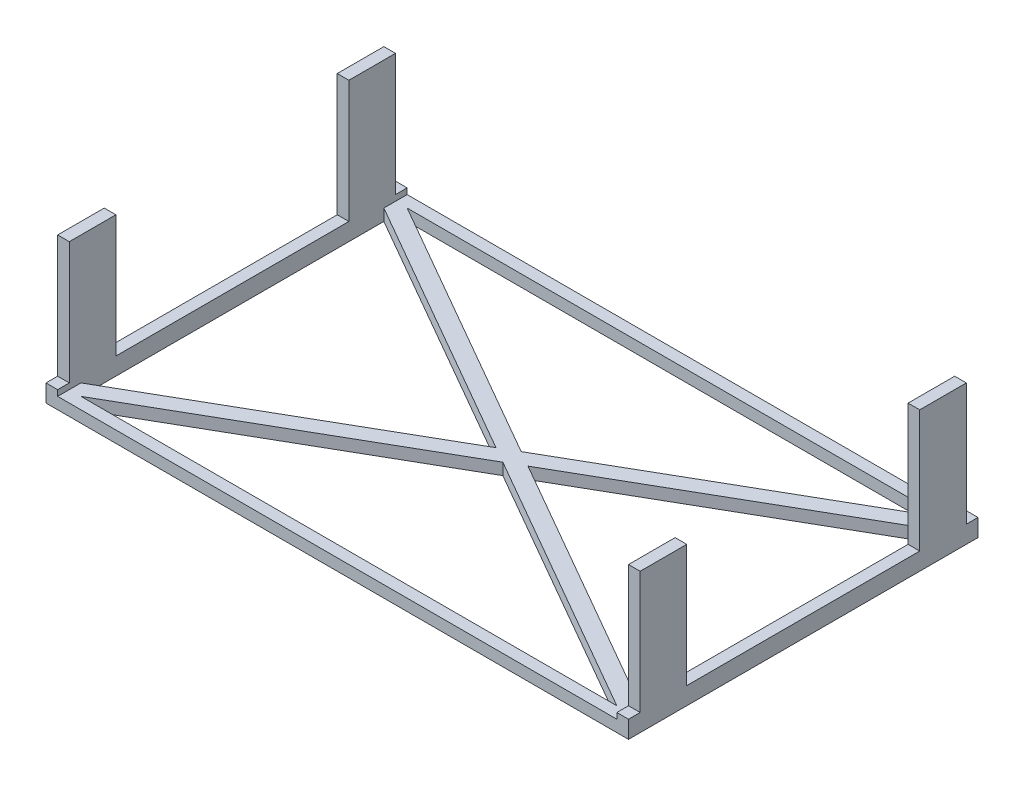
ISO-10303-21;
HEADER;
FILE_DESCRIPTION(('STEP AP214'),'2;1');
FILE_NAME('part.step','',(''),(''),'','','');
FILE_SCHEMA(('AUTOMOTIVE_DESIGN { 1 0 10303 214 1 1 1 1 }'));
ENDSEC;
DATA;
#1=APPLICATION_CONTEXT('core data for automotive mechanical design processes');
#2=APPLICATION_PROTOCOL_DEFINITION('international standard','automotive_design',2000,#1);
#3=PRODUCT_CONTEXT('',#1,'mechanical');
#4=PRODUCT('Part','Part','',(#3));
#5=PRODUCT_RELATED_PRODUCT_CATEGORY('part','',(#4));
#6=PRODUCT_DEFINITION_FORMATION('','',#4);
#7=PRODUCT_DEFINITION_CONTEXT('part definition',#1,'design');
#8=PRODUCT_DEFINITION('design','',#6,#7);
#9=PRODUCT_DEFINITION_SHAPE('','',#8);
#10=(LENGTH_UNIT() NAMED_UNIT(*) SI_UNIT(.MILLI.,.METRE.));
#11=(NAMED_UNIT(*) PLANE_ANGLE_UNIT() SI_UNIT($,.RADIAN.));
#12=(NAMED_UNIT(*) SI_UNIT($,.STERADIAN.) SOLID_ANGLE_UNIT());
#13=UNCERTAINTY_MEASURE_WITH_UNIT(LENGTH_MEASURE(1.E-05),#10,'distance_accuracy_value','');
#14=(GEOMETRIC_REPRESENTATION_CONTEXT(3) GLOBAL_UNCERTAINTY_ASSIGNED_CONTEXT((#13)) GLOBAL_UNIT_ASSIGNED_CONTEXT((#10,
#11,#12)) REPRESENTATION_CONTEXT('',''));
#15=CARTESIAN_POINT('',(0.,0.,0.));
#16=DIRECTION('',(0.,0.,1.));
#17=DIRECTION('',(1.,0.,0.));
#18=AXIS2_PLACEMENT_3D('',#15,#16,#17);
#19=CARTESIAN_POINT('',(0.,120.,0.));
#20=DIRECTION('',(0.,1.,0.));
#21=DIRECTION('',(0.,0.,1.));
#22=AXIS2_PLACEMENT_3D('',#19,#20,#21);
#23=PLANE('',#22);
#24=DIRECTION('',(-1.,0.,0.));
#25=VECTOR('',#24,1.);
#26=CARTESIAN_POINT('',(500.,120.,9.99999999999986));
#27=LINE('',#26,#25);
#28=CARTESIAN_POINT('',(500.,120.,9.99999999999986));
#29=VERTEX_POINT('',#28);
#30=CARTESIAN_POINT('',(490.,120.,9.99999999999986));
#31=VERTEX_POINT('',#30);
#32=EDGE_CURVE('E483',#29,#31,#27,.T.);
#33=ORIENTED_EDGE('',*,*,#32,.T.);
#34=DIRECTION('',(0.,0.,-1.));
#35=VECTOR('',#34,1.);
#36=CARTESIAN_POINT('',(490.,120.,300.));
#37=LINE('',#36,#35);
#38=CARTESIAN_POINT('',(490.,120.,49.9999999999999));
#39=VERTEX_POINT('',#38);
#40=EDGE_CURVE('E422',#39,#31,#37,.T.);
#41=ORIENTED_EDGE('',*,*,#40,.F.);
#42=DIRECTION('',(-1.,0.,0.));
#43=VECTOR('',#42,1.);
#44=CARTESIAN_POINT('',(500.,120.,49.9999999999999));
#45=LINE('',#44,#43);
#46=CARTESIAN_POINT('',(500.,120.,49.9999999999999));
#47=VERTEX_POINT('',#46);
#48=EDGE_CURVE('E535',#47,#39,#45,.T.);
#49=ORIENTED_EDGE('',*,*,#48,.F.);
#50=DIRECTION('',(0.,0.,1.));
#51=VECTOR('',#50,1.);
#52=CARTESIAN_POINT('',(500.,120.,0.));
#53=LINE('',#52,#51);
#54=EDGE_CURVE('E314',#29,#47,#53,.T.);
#55=ORIENTED_EDGE('',*,*,#54,.F.);
#56=EDGE_LOOP('',(#33,#41,#49,#55));
#57=FACE_BOUND('',#56,.T.);
#58=ADVANCED_FACE('F41',(#57),#23,.T.);
#59=CARTESIAN_POINT('',(10.,120.,10.));
#60=VERTEX_POINT('',#59);
#61=CARTESIAN_POINT('',(0.,120.,10.));
#62=VERTEX_POINT('',#61);
#63=EDGE_CURVE('E488',#60,#62,#27,.T.);
#64=ORIENTED_EDGE('',*,*,#63,.T.);
#65=DIRECTION('',(0.,0.,1.));
#66=VECTOR('',#65,1.);
#67=CARTESIAN_POINT('',(0.,120.,0.));
#68=LINE('',#67,#66);
#69=CARTESIAN_POINT('',(0.,120.,50.));
#70=VERTEX_POINT('',#69);
#71=EDGE_CURVE('E442',#62,#70,#68,.T.);
#72=ORIENTED_EDGE('',*,*,#71,.T.);
#73=CARTESIAN_POINT('',(10.,120.,50.));
#74=VERTEX_POINT('',#73);
#75=EDGE_CURVE('E539',#74,#70,#45,.T.);
#76=ORIENTED_EDGE('',*,*,#75,.F.);
#77=DIRECTION('',(0.,0.,-1.));
#78=VECTOR('',#77,1.);
#79=CARTESIAN_POINT('',(10.,120.,300.));
#80=LINE('',#79,#78);
#81=EDGE_CURVE('E428',#74,#60,#80,.T.);
#82=ORIENTED_EDGE('',*,*,#81,.T.);
#83=EDGE_LOOP('',(#64,#72,#76,#82));
#84=FACE_BOUND('',#83,.T.);
#85=ADVANCED_FACE('F710',(#84),#23,.T.);
#86=DIRECTION('',(-1.,0.,0.));
#87=VECTOR('',#86,1.);
#88=CARTESIAN_POINT('',(500.,120.,290.));
#89=LINE('',#88,#87);
#90=CARTESIAN_POINT('',(500.,120.,290.));
#91=VERTEX_POINT('',#90);
#92=CARTESIAN_POINT('',(490.,120.,290.));
#93=VERTEX_POINT('',#92);
#94=EDGE_CURVE('E474',#91,#93,#89,.T.);
#95=ORIENTED_EDGE('',*,*,#94,.F.);
#96=CARTESIAN_POINT('',(500.,120.,250.));
#97=VERTEX_POINT('',#96);
#98=EDGE_CURVE('E444',#97,#91,#53,.T.);
#99=ORIENTED_EDGE('',*,*,#98,.F.);
#100=DIRECTION('',(-1.,0.,0.));
#101=VECTOR('',#100,1.);
#102=CARTESIAN_POINT('',(500.,120.,250.));
#103=LINE('',#102,#101);
#104=CARTESIAN_POINT('',(490.,120.,250.));
#105=VERTEX_POINT('',#104);
#106=EDGE_CURVE('E540',#97,#105,#103,.T.);
#107=ORIENTED_EDGE('',*,*,#106,.T.);
#108=EDGE_CURVE('E426',#93,#105,#37,.T.);
#109=ORIENTED_EDGE('',*,*,#108,.F.);
#110=EDGE_LOOP('',(#95,#99,#107,#109));
#111=FACE_BOUND('',#110,.T.);
#112=ADVANCED_FACE('F687',(#111),#23,.T.);
#113=CARTESIAN_POINT('',(0.,120.,0.));
#114=DIRECTION('',(1.,0.,0.));
#115=DIRECTION('',(0.,0.,-1.));
#116=AXIS2_PLACEMENT_3D('',#113,#114,#115);
#117=PLANE('',#116);
#118=DIRECTION('',(0.,0.,1.));
#119=VECTOR('',#118,1.);
#120=CARTESIAN_POINT('',(0.,15.,290.));
#121=LINE('',#120,#119);
#122=CARTESIAN_POINT('',(0.,15.,290.));
#123=VERTEX_POINT('',#122);
#124=CARTESIAN_POINT('',(0.,15.,300.));
#125=VERTEX_POINT('',#124);
#126=EDGE_CURVE('E495',#123,#125,#121,.T.);
#127=ORIENTED_EDGE('',*,*,#126,.F.);
#128=DIRECTION('',(0.,-1.,0.));
#129=VECTOR('',#128,1.);
#130=CARTESIAN_POINT('',(0.,120.,290.));
#131=LINE('',#130,#129);
#132=CARTESIAN_POINT('',(0.,120.,290.));
#133=VERTEX_POINT('',#132);
#134=EDGE_CURVE('E500',#133,#123,#131,.T.);
#135=ORIENTED_EDGE('',*,*,#134,.F.);
#136=CARTESIAN_POINT('',(0.,120.,250.));
#137=VERTEX_POINT('',#136);
#138=EDGE_CURVE('E438',#137,#133,#68,.T.);
#139=ORIENTED_EDGE('',*,*,#138,.F.);
#140=DIRECTION('',(0.,1.,0.));
#141=VECTOR('',#140,1.);
#142=CARTESIAN_POINT('',(0.,120.,250.));
#143=LINE('',#142,#141);
#144=CARTESIAN_POINT('',(0.,15.,250.));
#145=VERTEX_POINT('',#144);
#146=EDGE_CURVE('E517',#145,#137,#143,.T.);
#147=ORIENTED_EDGE('',*,*,#146,.F.);
#148=DIRECTION('',(0.,0.,1.));
#149=VECTOR('',#148,1.);
#150=CARTESIAN_POINT('',(0.,15.,50.));
#151=LINE('',#150,#149);
#152=CARTESIAN_POINT('',(0.,15.,50.));
#153=VERTEX_POINT('',#152);
#154=EDGE_CURVE('E529',#153,#145,#151,.T.);
#155=ORIENTED_EDGE('',*,*,#154,.F.);
#156=DIRECTION('',(0.,-1.,0.));
#157=VECTOR('',#156,1.);
#158=CARTESIAN_POINT('',(0.,120.,50.));
#159=LINE('',#158,#157);
#160=EDGE_CURVE('E487',#70,#153,#159,.T.);
#161=ORIENTED_EDGE('',*,*,#160,.F.);
#162=ORIENTED_EDGE('',*,*,#71,.F.);
#163=DIRECTION('',(0.,1.,0.));
#164=VECTOR('',#163,1.);
#165=CARTESIAN_POINT('',(0.,120.,10.));
#166=LINE('',#165,#164);
#167=CARTESIAN_POINT('',(0.,15.,10.));
#168=VERTEX_POINT('',#167);
#169=EDGE_CURVE('E287',#168,#62,#166,.T.);
#170=ORIENTED_EDGE('',*,*,#169,.F.);
#171=DIRECTION('',(0.,0.,1.));
#172=VECTOR('',#171,1.);
#173=CARTESIAN_POINT('',(0.,15.,0.));
#174=LINE('',#173,#172);
#175=CARTESIAN_POINT('',(0.,15.,0.));
#176=VERTEX_POINT('',#175);
#177=EDGE_CURVE('E470',#176,#168,#174,.T.);
#178=ORIENTED_EDGE('',*,*,#177,.F.);
#179=DIRECTION('',(0.,-1.,0.));
#180=VECTOR('',#179,1.);
#181=CARTESIAN_POINT('',(0.,120.,0.));
#182=LINE('',#181,#180);
#183=CARTESIAN_POINT('',(0.,0.,0.));
#184=VERTEX_POINT('',#183);
#185=EDGE_CURVE('E308',#176,#184,#182,.T.);
#186=ORIENTED_EDGE('',*,*,#185,.T.);
#187=DIRECTION('',(0.,0.,1.));
#188=VECTOR('',#187,1.);
#189=CARTESIAN_POINT('',(0.,0.,0.));
#190=LINE('',#189,#188);
#191=CARTESIAN_POINT('',(0.,0.,300.));
#192=VERTEX_POINT('',#191);
#193=EDGE_CURVE('E448',#184,#192,#190,.T.);
#194=ORIENTED_EDGE('',*,*,#193,.T.);
#195=DIRECTION('',(0.,-1.,0.));
#196=VECTOR('',#195,1.);
#197=CARTESIAN_POINT('',(0.,120.,300.));
#198=LINE('',#197,#196);
#199=EDGE_CURVE('E312',#125,#192,#198,.T.);
#200=ORIENTED_EDGE('',*,*,#199,.F.);
#201=EDGE_LOOP('',(#127,#135,#139,#147,#155,#161,#162,#170,#178,#186,#194,#200));
#202=FACE_BOUND('',#201,.T.);
#203=ADVANCED_FACE('F43',(#202),#117,.F.);
#204=CARTESIAN_POINT('',(0.,120.,300.));
#205=DIRECTION('',(0.,0.,-1.));
#206=DIRECTION('',(-1.,0.,0.));
#207=AXIS2_PLACEMENT_3D('',#204,#205,#206);
#208=PLANE('',#207);
#209=DIRECTION('',(0.,-1.,0.));
#210=VECTOR('',#209,1.);
#211=CARTESIAN_POINT('',(500.,120.,300.));
#212=LINE('',#211,#210);
#213=CARTESIAN_POINT('',(500.,15.,300.));
#214=VERTEX_POINT('',#213);
#215=CARTESIAN_POINT('',(500.,0.,300.));
#216=VERTEX_POINT('',#215);
#217=EDGE_CURVE('E307',#214,#216,#212,.T.);
#218=ORIENTED_EDGE('',*,*,#217,.F.);
#219=DIRECTION('',(-1.,0.,0.));
#220=VECTOR('',#219,1.);
#221=CARTESIAN_POINT('',(500.,15.,300.));
#222=LINE('',#221,#220);
#223=CARTESIAN_POINT('',(490.,15.,300.));
#224=VERTEX_POINT('',#223);
#225=EDGE_CURVE('E506',#214,#224,#222,.T.);
#226=ORIENTED_EDGE('',*,*,#225,.T.);
#227=DIRECTION('',(0.,-1.,0.));
#228=VECTOR('',#227,1.);
#229=CARTESIAN_POINT('',(490.,120.,300.));
#230=LINE('',#229,#228);
#231=CARTESIAN_POINT('',(490.,10.,300.));
#232=VERTEX_POINT('',#231);
#233=EDGE_CURVE('E407',#224,#232,#230,.T.);
#234=ORIENTED_EDGE('',*,*,#233,.T.);
#235=DIRECTION('',(-1.,0.,0.));
#236=VECTOR('',#235,1.);
#237=CARTESIAN_POINT('',(490.,10.,300.));
#238=LINE('',#237,#236);
#239=CARTESIAN_POINT('',(10.,10.,300.));
#240=VERTEX_POINT('',#239);
#241=EDGE_CURVE('E398',#232,#240,#238,.T.);
#242=ORIENTED_EDGE('',*,*,#241,.T.);
#243=DIRECTION('',(0.,1.,0.));
#244=VECTOR('',#243,1.);
#245=CARTESIAN_POINT('',(10.,120.,300.));
#246=LINE('',#245,#244);
#247=CARTESIAN_POINT('',(10.,15.,300.));
#248=VERTEX_POINT('',#247);
#249=EDGE_CURVE('E387',#240,#248,#246,.T.);
#250=ORIENTED_EDGE('',*,*,#249,.T.);
#251=EDGE_CURVE('E395',#248,#125,#222,.T.);
#252=ORIENTED_EDGE('',*,*,#251,.T.);
#253=ORIENTED_EDGE('',*,*,#199,.T.);
#254=DIRECTION('',(1.,0.,0.));
#255=VECTOR('',#254,1.);
#256=CARTESIAN_POINT('',(0.,0.,300.));
#257=LINE('',#256,#255);
#258=EDGE_CURVE('E452',#192,#216,#257,.T.);
#259=ORIENTED_EDGE('',*,*,#258,.T.);
#260=EDGE_LOOP('',(#218,#226,#234,#242,#250,#252,#253,#259));
#261=FACE_BOUND('',#260,.T.);
#262=ADVANCED_FACE('F394',(#261),#208,.F.);
#263=CARTESIAN_POINT('',(500.,120.,0.));
#264=DIRECTION('',(1.,0.,0.));
#265=DIRECTION('',(0.,0.,-1.));
#266=AXIS2_PLACEMENT_3D('',#263,#264,#265);
#267=PLANE('',#266);
#268=DIRECTION('',(0.,-1.,0.));
#269=VECTOR('',#268,1.);
#270=CARTESIAN_POINT('',(500.,120.,290.));
#271=LINE('',#270,#269);
#272=CARTESIAN_POINT('',(500.,15.,290.));
#273=VERTEX_POINT('',#272);
#274=EDGE_CURVE('E491',#91,#273,#271,.T.);
#275=ORIENTED_EDGE('',*,*,#274,.T.);
#276=DIRECTION('',(0.,0.,1.));
#277=VECTOR('',#276,1.);
#278=CARTESIAN_POINT('',(500.,15.,290.));
#279=LINE('',#278,#277);
#280=EDGE_CURVE('E494',#273,#214,#279,.T.);
#281=ORIENTED_EDGE('',*,*,#280,.T.);
#282=ORIENTED_EDGE('',*,*,#217,.T.);
#283=DIRECTION('',(0.,0.,1.));
#284=VECTOR('',#283,1.);
#285=CARTESIAN_POINT('',(500.,0.,0.));
#286=LINE('',#285,#284);
#287=CARTESIAN_POINT('',(500.,0.,0.));
#288=VERTEX_POINT('',#287);
#289=EDGE_CURVE('E304',#288,#216,#286,.T.);
#290=ORIENTED_EDGE('',*,*,#289,.F.);
#291=DIRECTION('',(0.,-1.,0.));
#292=VECTOR('',#291,1.);
#293=CARTESIAN_POINT('',(500.,120.,0.));
#294=LINE('',#293,#292);
#295=CARTESIAN_POINT('',(500.,15.,-1.25919086687097E-13));
#296=VERTEX_POINT('',#295);
#297=EDGE_CURVE('E293',#296,#288,#294,.T.);
#298=ORIENTED_EDGE('',*,*,#297,.F.);
#299=DIRECTION('',(0.,0.,1.));
#300=VECTOR('',#299,1.);
#301=CARTESIAN_POINT('',(500.,15.,-1.25919086687097E-13));
#302=LINE('',#301,#300);
#303=CARTESIAN_POINT('',(500.,15.,9.99999999999987));
#304=VERTEX_POINT('',#303);
#305=EDGE_CURVE('E274',#296,#304,#302,.T.);
#306=ORIENTED_EDGE('',*,*,#305,.T.);
#307=DIRECTION('',(0.,1.,0.));
#308=VECTOR('',#307,1.);
#309=CARTESIAN_POINT('',(500.,120.,9.99999999999986));
#310=LINE('',#309,#308);
#311=EDGE_CURVE('E286',#304,#29,#310,.T.);
#312=ORIENTED_EDGE('',*,*,#311,.T.);
#313=ORIENTED_EDGE('',*,*,#54,.T.);
#314=DIRECTION('',(0.,-1.,0.));
#315=VECTOR('',#314,1.);
#316=CARTESIAN_POINT('',(500.,120.,49.9999999999999));
#317=LINE('',#316,#315);
#318=CARTESIAN_POINT('',(500.,15.,49.9999999999999));
#319=VERTEX_POINT('',#318);
#320=EDGE_CURVE('E512',#47,#319,#317,.T.);
#321=ORIENTED_EDGE('',*,*,#320,.T.);
#322=DIRECTION('',(0.,0.,1.));
#323=VECTOR('',#322,1.);
#324=CARTESIAN_POINT('',(500.,15.,49.9999999999999));
#325=LINE('',#324,#323);
#326=CARTESIAN_POINT('',(500.,15.,250.));
#327=VERTEX_POINT('',#326);
#328=EDGE_CURVE('E516',#319,#327,#325,.T.);
#329=ORIENTED_EDGE('',*,*,#328,.T.);
#330=DIRECTION('',(0.,1.,0.));
#331=VECTOR('',#330,1.);
#332=CARTESIAN_POINT('',(500.,120.,250.));
#333=LINE('',#332,#331);
#334=EDGE_CURVE('E521',#327,#97,#333,.T.);
#335=ORIENTED_EDGE('',*,*,#334,.T.);
#336=ORIENTED_EDGE('',*,*,#98,.T.);
#337=EDGE_LOOP('',(#275,#281,#282,#290,#298,#306,#312,#313,#321,#329,#335,#336));
#338=FACE_BOUND('',#337,.T.);
#339=ADVANCED_FACE('F302',(#338),#267,.T.);
#340=CARTESIAN_POINT('',(0.,120.,0.));
#341=DIRECTION('',(0.,0.,-1.));
#342=DIRECTION('',(-1.,0.,0.));
#343=AXIS2_PLACEMENT_3D('',#340,#341,#342);
#344=PLANE('',#343);
#345=DIRECTION('',(-1.,0.,0.));
#346=VECTOR('',#345,1.);
#347=CARTESIAN_POINT('',(500.,15.,-1.25919086687097E-13));
#348=LINE('',#347,#346);
#349=CARTESIAN_POINT('',(490.,15.,0.));
#350=VERTEX_POINT('',#349);
#351=EDGE_CURVE('E277',#296,#350,#348,.T.);
#352=ORIENTED_EDGE('',*,*,#351,.F.);
#353=ORIENTED_EDGE('',*,*,#297,.T.);
#354=DIRECTION('',(1.,0.,0.));
#355=VECTOR('',#354,1.);
#356=CARTESIAN_POINT('',(0.,0.,0.));
#357=LINE('',#356,#355);
#358=EDGE_CURVE('E443',#184,#288,#357,.T.);
#359=ORIENTED_EDGE('',*,*,#358,.F.);
#360=ORIENTED_EDGE('',*,*,#185,.F.);
#361=CARTESIAN_POINT('',(10.,15.,0.));
#362=VERTEX_POINT('',#361);
#363=EDGE_CURVE('E299',#362,#176,#348,.T.);
#364=ORIENTED_EDGE('',*,*,#363,.F.);
#365=DIRECTION('',(0.,1.,0.));
#366=VECTOR('',#365,1.);
#367=CARTESIAN_POINT('',(10.,120.,0.));
#368=LINE('',#367,#366);
#369=CARTESIAN_POINT('',(10.,10.,0.));
#370=VERTEX_POINT('',#369);
#371=EDGE_CURVE('E418',#370,#362,#368,.T.);
#372=ORIENTED_EDGE('',*,*,#371,.F.);
#373=DIRECTION('',(-1.,0.,0.));
#374=VECTOR('',#373,1.);
#375=CARTESIAN_POINT('',(490.,10.,0.));
#376=LINE('',#375,#374);
#377=CARTESIAN_POINT('',(490.,10.,0.));
#378=VERTEX_POINT('',#377);
#379=EDGE_CURVE('E413',#378,#370,#376,.T.);
#380=ORIENTED_EDGE('',*,*,#379,.F.);
#381=DIRECTION('',(0.,-1.,0.));
#382=VECTOR('',#381,1.);
#383=CARTESIAN_POINT('',(490.,120.,0.));
#384=LINE('',#383,#382);
#385=EDGE_CURVE('E296',#350,#378,#384,.T.);
#386=ORIENTED_EDGE('',*,*,#385,.F.);
#387=EDGE_LOOP('',(#352,#353,#359,#360,#364,#372,#380,#386));
#388=FACE_BOUND('',#387,.T.);
#389=ADVANCED_FACE('F291',(#388),#344,.T.);
#390=CARTESIAN_POINT('',(10.,120.,290.));
#391=VERTEX_POINT('',#390);
#392=EDGE_CURVE('E479',#391,#133,#89,.T.);
#393=ORIENTED_EDGE('',*,*,#392,.F.);
#394=CARTESIAN_POINT('',(10.,120.,250.));
#395=VERTEX_POINT('',#394);
#396=EDGE_CURVE('E427',#391,#395,#80,.T.);
#397=ORIENTED_EDGE('',*,*,#396,.T.);
#398=EDGE_CURVE('E544',#395,#137,#103,.T.);
#399=ORIENTED_EDGE('',*,*,#398,.T.);
#400=ORIENTED_EDGE('',*,*,#138,.T.);
#401=EDGE_LOOP('',(#393,#397,#399,#400));
#402=FACE_BOUND('',#401,.T.);
#403=ADVANCED_FACE('F737',(#402),#23,.T.);
#404=CARTESIAN_POINT('',(0.,0.,0.));
#405=DIRECTION('',(0.,1.,0.));
#406=DIRECTION('',(0.,0.,1.));
#407=AXIS2_PLACEMENT_3D('',#404,#405,#406);
#408=PLANE('',#407);
#409=DIRECTION('',(0.,0.,1.));
#410=VECTOR('',#409,1.);
#411=CARTESIAN_POINT('',(490.,0.,280.));
#412=LINE('',#411,#410);
#413=CARTESIAN_POINT('',(490.,0.,19.9999999999977));
#414=VERTEX_POINT('',#413);
#415=CARTESIAN_POINT('',(490.,0.,280.));
#416=VERTEX_POINT('',#415);
#417=EDGE_CURVE('E602',#414,#416,#412,.T.);
#418=ORIENTED_EDGE('',*,*,#417,.F.);
#419=DIRECTION('',(0.867105542470767,0.,-0.498124460568317));
#420=VECTOR('',#419,1.);
#421=CARTESIAN_POINT('',(490.,0.,19.9999999999977));
#422=LINE('',#421,#420);
#423=CARTESIAN_POINT('',(263.703703703703,0.,149.999999999999));
#424=VERTEX_POINT('',#423);
#425=EDGE_CURVE('E593',#424,#414,#422,.T.);
#426=ORIENTED_EDGE('',*,*,#425,.F.);
#427=DIRECTION('',(-0.867105542470769,0.,-0.498124460568314));
#428=VECTOR('',#427,1.);
#429=CARTESIAN_POINT('',(263.703703703703,0.,149.999999999999));
#430=LINE('',#429,#428);
#431=EDGE_CURVE('E606',#416,#424,#430,.T.);
#432=ORIENTED_EDGE('',*,*,#431,.F.);
#433=EDGE_LOOP('',(#418,#426,#432));
#434=FACE_BOUND('',#433,.T.);
#435=DIRECTION('',(0.867105542470769,0.,0.498124460568314));
#436=VECTOR('',#435,1.);
#437=CARTESIAN_POINT('',(480.,0.,290.));
#438=LINE('',#437,#436);
#439=CARTESIAN_POINT('',(249.999999999999,0.,157.872340425531));
#440=VERTEX_POINT('',#439);
#441=CARTESIAN_POINT('',(480.,0.,290.));
#442=VERTEX_POINT('',#441);
#443=EDGE_CURVE('E623',#440,#442,#438,.T.);
#444=ORIENTED_EDGE('',*,*,#443,.F.);
#445=DIRECTION('',(0.867105542470767,0.,-0.498124460568317));
#446=VECTOR('',#445,1.);
#447=CARTESIAN_POINT('',(249.999999999999,0.,157.872340425531));
#448=LINE('',#447,#446);
#449=CARTESIAN_POINT('',(20.,0.,290.));
#450=VERTEX_POINT('',#449);
#451=EDGE_CURVE('E614',#450,#440,#448,.T.);
#452=ORIENTED_EDGE('',*,*,#451,.F.);
#453=DIRECTION('',(-1.,0.,0.));
#454=VECTOR('',#453,1.);
#455=CARTESIAN_POINT('',(20.,0.,290.));
#456=LINE('',#455,#454);
#457=EDGE_CURVE('E627',#442,#450,#456,.T.);
#458=ORIENTED_EDGE('',*,*,#457,.F.);
#459=EDGE_LOOP('',(#444,#452,#458));
#460=FACE_BOUND('',#459,.T.);
#461=DIRECTION('',(-0.867105542470769,0.,-0.498124460568314));
#462=VECTOR('',#461,1.);
#463=CARTESIAN_POINT('',(249.999999999999,0.,142.127659574467));
#464=LINE('',#463,#462);
#465=CARTESIAN_POINT('',(249.999999999999,0.,142.127659574467));
#466=VERTEX_POINT('',#465);
#467=CARTESIAN_POINT('',(20.,0.,10.));
#468=VERTEX_POINT('',#467);
#469=EDGE_CURVE('E581',#466,#468,#464,.T.);
#470=ORIENTED_EDGE('',*,*,#469,.F.);
#471=DIRECTION('',(-0.867105542470767,0.,0.498124460568317));
#472=VECTOR('',#471,1.);
#473=CARTESIAN_POINT('',(479.999999999996,0.,10.));
#474=LINE('',#473,#472);
#475=CARTESIAN_POINT('',(479.999999999996,0.,10.));
#476=VERTEX_POINT('',#475);
#477=EDGE_CURVE('E578',#476,#466,#474,.T.);
#478=ORIENTED_EDGE('',*,*,#477,.F.);
#479=DIRECTION('',(1.,0.,0.));
#480=VECTOR('',#479,1.);
#481=CARTESIAN_POINT('',(20.,0.,10.));
#482=LINE('',#481,#480);
#483=EDGE_CURVE('E585',#468,#476,#482,.T.);
#484=ORIENTED_EDGE('',*,*,#483,.F.);
#485=EDGE_LOOP('',(#470,#478,#484));
#486=FACE_BOUND('',#485,.T.);
#487=DIRECTION('',(-0.867105542470767,0.,0.498124460568317));
#488=VECTOR('',#487,1.);
#489=CARTESIAN_POINT('',(236.296296296295,0.,149.999999999999));
#490=LINE('',#489,#488);
#491=CARTESIAN_POINT('',(236.296296296295,0.,149.999999999999));
#492=VERTEX_POINT('',#491);
#493=CARTESIAN_POINT('',(10.,0.,280.));
#494=VERTEX_POINT('',#493);
#495=EDGE_CURVE('E644',#492,#494,#490,.T.);
#496=ORIENTED_EDGE('',*,*,#495,.F.);
#497=DIRECTION('',(0.867105542470769,0.,0.498124460568314));
#498=VECTOR('',#497,1.);
#499=CARTESIAN_POINT('',(10.,0.,19.9999999999999));
#500=LINE('',#499,#498);
#501=CARTESIAN_POINT('',(10.,0.,19.9999999999999));
#502=VERTEX_POINT('',#501);
#503=EDGE_CURVE('E635',#502,#492,#500,.T.);
#504=ORIENTED_EDGE('',*,*,#503,.F.);
#505=DIRECTION('',(0.,0.,-1.));
#506=VECTOR('',#505,1.);
#507=CARTESIAN_POINT('',(10.,0.,280.));
#508=LINE('',#507,#506);
#509=EDGE_CURVE('E648',#494,#502,#508,.T.);
#510=ORIENTED_EDGE('',*,*,#509,.F.);
#511=EDGE_LOOP('',(#496,#504,#510));
#512=FACE_BOUND('',#511,.T.);
#513=ORIENTED_EDGE('',*,*,#193,.F.);
#514=ORIENTED_EDGE('',*,*,#358,.T.);
#515=ORIENTED_EDGE('',*,*,#289,.T.);
#516=ORIENTED_EDGE('',*,*,#258,.F.);
#517=EDGE_LOOP('',(#513,#514,#515,#516));
#518=FACE_BOUND('',#517,.T.);
#519=ADVANCED_FACE('F460',(#434,#460,#486,#512,#518),#408,.F.);
#520=CARTESIAN_POINT('',(490.,120.,300.));
#521=DIRECTION('',(1.,0.,0.));
#522=DIRECTION('',(0.,0.,-1.));
#523=AXIS2_PLACEMENT_3D('',#520,#521,#522);
#524=PLANE('',#523);
#525=DIRECTION('',(0.,0.,-1.));
#526=VECTOR('',#525,1.);
#527=CARTESIAN_POINT('',(490.,15.,300.));
#528=LINE('',#527,#526);
#529=CARTESIAN_POINT('',(490.,15.,290.));
#530=VERTEX_POINT('',#529);
#531=EDGE_CURVE('E570',#224,#530,#528,.T.);
#532=ORIENTED_EDGE('',*,*,#531,.T.);
#533=DIRECTION('',(0.,1.,0.));
#534=VECTOR('',#533,1.);
#535=CARTESIAN_POINT('',(490.,120.,290.));
#536=LINE('',#535,#534);
#537=EDGE_CURVE('E574',#530,#93,#536,.T.);
#538=ORIENTED_EDGE('',*,*,#537,.T.);
#539=ORIENTED_EDGE('',*,*,#108,.T.);
#540=DIRECTION('',(0.,-1.,0.));
#541=VECTOR('',#540,1.);
#542=CARTESIAN_POINT('',(490.,120.,250.));
#543=LINE('',#542,#541);
#544=CARTESIAN_POINT('',(490.,15.,250.));
#545=VERTEX_POINT('',#544);
#546=EDGE_CURVE('E555',#105,#545,#543,.T.);
#547=ORIENTED_EDGE('',*,*,#546,.T.);
#548=DIRECTION('',(0.,0.,-1.));
#549=VECTOR('',#548,1.);
#550=CARTESIAN_POINT('',(490.,15.,300.));
#551=LINE('',#550,#549);
#552=CARTESIAN_POINT('',(490.,15.,49.9999999999998));
#553=VERTEX_POINT('',#552);
#554=EDGE_CURVE('E538',#545,#553,#551,.T.);
#555=ORIENTED_EDGE('',*,*,#554,.T.);
#556=DIRECTION('',(0.,1.,0.));
#557=VECTOR('',#556,1.);
#558=CARTESIAN_POINT('',(490.,120.,49.9999999999999));
#559=LINE('',#558,#557);
#560=EDGE_CURVE('E559',#553,#39,#559,.T.);
#561=ORIENTED_EDGE('',*,*,#560,.T.);
#562=ORIENTED_EDGE('',*,*,#40,.T.);
#563=DIRECTION('',(0.,-1.,0.));
#564=VECTOR('',#563,1.);
#565=CARTESIAN_POINT('',(490.,120.,9.99999999999984));
#566=LINE('',#565,#564);
#567=CARTESIAN_POINT('',(490.,15.,9.99999999999988));
#568=VERTEX_POINT('',#567);
#569=EDGE_CURVE('E566',#31,#568,#566,.T.);
#570=ORIENTED_EDGE('',*,*,#569,.T.);
#571=DIRECTION('',(0.,0.,-1.));
#572=VECTOR('',#571,1.);
#573=CARTESIAN_POINT('',(490.,15.,300.));
#574=LINE('',#573,#572);
#575=EDGE_CURVE('E563',#568,#350,#574,.T.);
#576=ORIENTED_EDGE('',*,*,#575,.T.);
#577=ORIENTED_EDGE('',*,*,#385,.T.);
#578=DIRECTION('',(0.,0.,-1.));
#579=VECTOR('',#578,1.);
#580=CARTESIAN_POINT('',(490.,10.,300.));
#581=LINE('',#580,#579);
#582=CARTESIAN_POINT('',(490.,9.99999999999999,19.9999999999977));
#583=VERTEX_POINT('',#582);
#584=EDGE_CURVE('E400',#583,#378,#581,.T.);
#585=ORIENTED_EDGE('',*,*,#584,.F.);
#586=DIRECTION('',(0.,-1.,0.));
#587=VECTOR('',#586,1.);
#588=CARTESIAN_POINT('',(490.,120.,19.9999999999977));
#589=LINE('',#588,#587);
#590=EDGE_CURVE('E610',#583,#414,#589,.T.);
#591=ORIENTED_EDGE('',*,*,#590,.T.);
#592=ORIENTED_EDGE('',*,*,#417,.T.);
#593=DIRECTION('',(0.,-1.,0.));
#594=VECTOR('',#593,1.);
#595=CARTESIAN_POINT('',(490.,120.,280.));
#596=LINE('',#595,#594);
#597=CARTESIAN_POINT('',(490.,10.,280.));
#598=VERTEX_POINT('',#597);
#599=EDGE_CURVE('E615',#598,#416,#596,.T.);
#600=ORIENTED_EDGE('',*,*,#599,.F.);
#601=EDGE_CURVE('E405',#232,#598,#581,.T.);
#602=ORIENTED_EDGE('',*,*,#601,.F.);
#603=ORIENTED_EDGE('',*,*,#233,.F.);
#604=EDGE_LOOP('',(#532,#538,#539,#547,#555,#561,#562,#570,#576,#577,#585,#591,#592,#600,#602,#603));
#605=FACE_BOUND('',#604,.T.);
#606=ADVANCED_FACE('F664',(#605),#524,.F.);
#607=CARTESIAN_POINT('',(10.,120.,300.));
#608=DIRECTION('',(-1.,0.,0.));
#609=DIRECTION('',(0.,-1.,0.));
#610=AXIS2_PLACEMENT_3D('',#607,#608,#609);
#611=PLANE('',#610);
#612=ORIENTED_EDGE('',*,*,#396,.F.);
#613=DIRECTION('',(0.,-1.,0.));
#614=VECTOR('',#613,1.);
#615=CARTESIAN_POINT('',(10.,120.,290.));
#616=LINE('',#615,#614);
#617=CARTESIAN_POINT('',(10.,15.,290.));
#618=VERTEX_POINT('',#617);
#619=EDGE_CURVE('E11',#391,#618,#616,.T.);
#620=ORIENTED_EDGE('',*,*,#619,.T.);
#621=DIRECTION('',(0.,0.,1.));
#622=VECTOR('',#621,1.);
#623=CARTESIAN_POINT('',(10.,15.,300.));
#624=LINE('',#623,#622);
#625=EDGE_CURVE('E50',#618,#248,#624,.T.);
#626=ORIENTED_EDGE('',*,*,#625,.T.);
#627=ORIENTED_EDGE('',*,*,#249,.F.);
#628=DIRECTION('',(0.,0.,-1.));
#629=VECTOR('',#628,1.);
#630=CARTESIAN_POINT('',(10.,10.,300.));
#631=LINE('',#630,#629);
#632=CARTESIAN_POINT('',(9.99999999999993,10.,280.));
#633=VERTEX_POINT('',#632);
#634=EDGE_CURVE('E432',#240,#633,#631,.T.);
#635=ORIENTED_EDGE('',*,*,#634,.T.);
#636=DIRECTION('',(0.,-1.,0.));
#637=VECTOR('',#636,1.);
#638=CARTESIAN_POINT('',(10.,120.,280.));
#639=LINE('',#638,#637);
#640=EDGE_CURVE('E655',#633,#494,#639,.T.);
#641=ORIENTED_EDGE('',*,*,#640,.T.);
#642=ORIENTED_EDGE('',*,*,#509,.T.);
#643=DIRECTION('',(0.,-1.,0.));
#644=VECTOR('',#643,1.);
#645=CARTESIAN_POINT('',(10.,120.,19.9999999999999));
#646=LINE('',#645,#644);
#647=CARTESIAN_POINT('',(10.,10.,19.9999999999999));
#648=VERTEX_POINT('',#647);
#649=EDGE_CURVE('E414',#648,#502,#646,.T.);
#650=ORIENTED_EDGE('',*,*,#649,.F.);
#651=EDGE_CURVE('E434',#648,#370,#631,.T.);
#652=ORIENTED_EDGE('',*,*,#651,.T.);
#653=ORIENTED_EDGE('',*,*,#371,.T.);
#654=DIRECTION('',(0.,0.,1.));
#655=VECTOR('',#654,1.);
#656=CARTESIAN_POINT('',(10.,15.,300.));
#657=LINE('',#656,#655);
#658=CARTESIAN_POINT('',(10.,15.,10.0000000000001));
#659=VERTEX_POINT('',#658);
#660=EDGE_CURVE('E372',#362,#659,#657,.T.);
#661=ORIENTED_EDGE('',*,*,#660,.T.);
#662=DIRECTION('',(0.,1.,0.));
#663=VECTOR('',#662,1.);
#664=CARTESIAN_POINT('',(10.,120.,9.99999999999995));
#665=LINE('',#664,#663);
#666=EDGE_CURVE('E376',#659,#60,#665,.T.);
#667=ORIENTED_EDGE('',*,*,#666,.T.);
#668=ORIENTED_EDGE('',*,*,#81,.F.);
#669=DIRECTION('',(0.,-1.,0.));
#670=VECTOR('',#669,1.);
#671=CARTESIAN_POINT('',(10.,120.,50.));
#672=LINE('',#671,#670);
#673=CARTESIAN_POINT('',(10.,15.,50.));
#674=VERTEX_POINT('',#673);
#675=EDGE_CURVE('E368',#74,#674,#672,.T.);
#676=ORIENTED_EDGE('',*,*,#675,.T.);
#677=DIRECTION('',(0.,0.,1.));
#678=VECTOR('',#677,1.);
#679=CARTESIAN_POINT('',(10.,15.,300.));
#680=LINE('',#679,#678);
#681=CARTESIAN_POINT('',(10.,15.,250.));
#682=VERTEX_POINT('',#681);
#683=EDGE_CURVE('E360',#674,#682,#680,.T.);
#684=ORIENTED_EDGE('',*,*,#683,.T.);
#685=DIRECTION('',(0.,1.,0.));
#686=VECTOR('',#685,1.);
#687=CARTESIAN_POINT('',(10.,120.,250.));
#688=LINE('',#687,#686);
#689=EDGE_CURVE('E364',#682,#395,#688,.T.);
#690=ORIENTED_EDGE('',*,*,#689,.T.);
#691=EDGE_LOOP('',(#612,#620,#626,#627,#635,#641,#642,#650,#652,#653,#661,#667,#668,#676,#684,#690));
#692=FACE_BOUND('',#691,.T.);
#693=ADVANCED_FACE('F385',(#692),#611,.F.);
#694=CARTESIAN_POINT('',(490.,10.,300.));
#695=DIRECTION('',(0.,-1.,0.));
#696=DIRECTION('',(1.,0.,0.));
#697=AXIS2_PLACEMENT_3D('',#694,#695,#696);
#698=PLANE('',#697);
#699=DIRECTION('',(-1.,0.,0.));
#700=VECTOR('',#699,1.);
#701=CARTESIAN_POINT('',(490.,10.,290.));
#702=LINE('',#701,#700);
#703=CARTESIAN_POINT('',(480.,10.,290.));
#704=VERTEX_POINT('',#703);
#705=CARTESIAN_POINT('',(20.,10.,290.));
#706=VERTEX_POINT('',#705);
#707=EDGE_CURVE('E344',#704,#706,#702,.T.);
#708=ORIENTED_EDGE('',*,*,#707,.T.);
#709=DIRECTION('',(0.867105542470767,0.,-0.498124460568317));
#710=VECTOR('',#709,1.);
#711=CARTESIAN_POINT('',(369.060585432265,10.,89.4758339006118));
#712=LINE('',#711,#710);
#713=CARTESIAN_POINT('',(249.999999999999,10.,157.872340425531));
#714=VERTEX_POINT('',#713);
#715=EDGE_CURVE('E348',#706,#714,#712,.T.);
#716=ORIENTED_EDGE('',*,*,#715,.T.);
#717=DIRECTION('',(0.867105542470769,0.,0.498124460568314));
#718=VECTOR('',#717,1.);
#719=CARTESIAN_POINT('',(491.837985023826,10.,296.800544588155));
#720=LINE('',#719,#718);
#721=EDGE_CURVE('E340',#714,#704,#720,.T.);
#722=ORIENTED_EDGE('',*,*,#721,.T.);
#723=EDGE_LOOP('',(#708,#716,#722));
#724=FACE_BOUND('',#723,.T.);
#725=DIRECTION('',(1.,0.,0.));
#726=VECTOR('',#725,1.);
#727=CARTESIAN_POINT('',(490.,10.,10.));
#728=LINE('',#727,#726);
#729=CARTESIAN_POINT('',(20.,10.,10.));
#730=VERTEX_POINT('',#729);
#731=CARTESIAN_POINT('',(479.999999999996,10.,10.));
#732=VERTEX_POINT('',#731);
#733=EDGE_CURVE('E332',#730,#732,#728,.T.);
#734=ORIENTED_EDGE('',*,*,#733,.T.);
#735=DIRECTION('',(-0.867105542470767,0.,0.498124460568317));
#736=VECTOR('',#735,1.);
#737=CARTESIAN_POINT('',(362.26004084411,10.,77.6378488767861));
#738=LINE('',#737,#736);
#739=CARTESIAN_POINT('',(249.999999999999,10.,142.127659574467));
#740=VERTEX_POINT('',#739);
#741=EDGE_CURVE('E336',#732,#740,#738,.T.);
#742=ORIENTED_EDGE('',*,*,#741,.T.);
#743=DIRECTION('',(-0.867105542470769,0.,-0.498124460568314));
#744=VECTOR('',#743,1.);
#745=CARTESIAN_POINT('',(498.638529611981,10.,284.962559564329));
#746=LINE('',#745,#744);
#747=EDGE_CURVE('E328',#740,#730,#746,.T.);
#748=ORIENTED_EDGE('',*,*,#747,.T.);
#749=EDGE_LOOP('',(#734,#742,#748));
#750=FACE_BOUND('',#749,.T.);
#751=DIRECTION('',(-0.867105542470769,0.,-0.498124460568314));
#752=VECTOR('',#751,1.);
#753=CARTESIAN_POINT('',(498.638529611981,10.,284.962559564329));
#754=LINE('',#753,#752);
#755=CARTESIAN_POINT('',(263.703703703703,9.99999999999999,149.999999999999));
#756=VERTEX_POINT('',#755);
#757=EDGE_CURVE('E352',#598,#756,#754,.T.);
#758=ORIENTED_EDGE('',*,*,#757,.T.);
#759=DIRECTION('',(0.867105542470767,0.,-0.498124460568317));
#760=VECTOR('',#759,1.);
#761=CARTESIAN_POINT('',(369.060585432265,10.,89.4758339006118));
#762=LINE('',#761,#760);
#763=EDGE_CURVE('E356',#756,#583,#762,.T.);
#764=ORIENTED_EDGE('',*,*,#763,.T.);
#765=ORIENTED_EDGE('',*,*,#584,.T.);
#766=ORIENTED_EDGE('',*,*,#379,.T.);
#767=ORIENTED_EDGE('',*,*,#651,.F.);
#768=DIRECTION('',(0.867105542470769,0.,0.498124460568314));
#769=VECTOR('',#768,1.);
#770=CARTESIAN_POINT('',(491.837985023826,10.,296.800544588155));
#771=LINE('',#770,#769);
#772=CARTESIAN_POINT('',(236.296296296295,10.,149.999999999999));
#773=VERTEX_POINT('',#772);
#774=EDGE_CURVE('E324',#648,#773,#771,.T.);
#775=ORIENTED_EDGE('',*,*,#774,.T.);
#776=DIRECTION('',(-0.867105542470767,0.,0.498124460568317));
#777=VECTOR('',#776,1.);
#778=CARTESIAN_POINT('',(362.26004084411,10.,77.6378488767862));
#779=LINE('',#778,#777);
#780=EDGE_CURVE('E320',#773,#633,#779,.T.);
#781=ORIENTED_EDGE('',*,*,#780,.T.);
#782=ORIENTED_EDGE('',*,*,#634,.F.);
#783=ORIENTED_EDGE('',*,*,#241,.F.);
#784=ORIENTED_EDGE('',*,*,#601,.T.);
#785=EDGE_LOOP('',(#758,#764,#765,#766,#767,#775,#781,#782,#783,#784));
#786=FACE_BOUND('',#785,.T.);
#787=ADVANCED_FACE('F667',(#724,#750,#786),#698,.F.);
#788=CARTESIAN_POINT('',(10.,120.,19.9999999999999));
#789=DIRECTION('',(0.498124460568314,0.,-0.867105542470769));
#790=DIRECTION('',(-0.867105542470769,0.,-0.498124460568314));
#791=AXIS2_PLACEMENT_3D('',#788,#789,#790);
#792=PLANE('',#791);
#793=ORIENTED_EDGE('',*,*,#649,.T.);
#794=ORIENTED_EDGE('',*,*,#503,.T.);
#795=DIRECTION('',(0.,-1.,0.));
#796=VECTOR('',#795,1.);
#797=CARTESIAN_POINT('',(236.296296296295,120.,149.999999999999));
#798=LINE('',#797,#796);
#799=EDGE_CURVE('E652',#773,#492,#798,.T.);
#800=ORIENTED_EDGE('',*,*,#799,.F.);
#801=ORIENTED_EDGE('',*,*,#774,.F.);
#802=EDGE_LOOP('',(#793,#794,#800,#801));
#803=FACE_BOUND('',#802,.T.);
#804=ADVANCED_FACE('F677',(#803),#792,.F.);
#805=CARTESIAN_POINT('',(236.296296296295,120.,149.999999999999));
#806=DIRECTION('',(0.498124460568317,0.,0.867105542470767));
#807=DIRECTION('',(0.867105542470767,0.,-0.498124460568317));
#808=AXIS2_PLACEMENT_3D('',#805,#806,#807);
#809=PLANE('',#808);
#810=ORIENTED_EDGE('',*,*,#799,.T.);
#811=ORIENTED_EDGE('',*,*,#495,.T.);
#812=ORIENTED_EDGE('',*,*,#640,.F.);
#813=ORIENTED_EDGE('',*,*,#780,.F.);
#814=EDGE_LOOP('',(#810,#811,#812,#813));
#815=FACE_BOUND('',#814,.T.);
#816=ADVANCED_FACE('F673',(#815),#809,.F.);
#817=CARTESIAN_POINT('',(479.999999999996,120.,10.));
#818=DIRECTION('',(0.498124460568317,0.,0.867105542470767));
#819=DIRECTION('',(0.867105542470767,0.,-0.498124460568317));
#820=AXIS2_PLACEMENT_3D('',#817,#818,#819);
#821=PLANE('',#820);
#822=DIRECTION('',(0.,-1.,0.));
#823=VECTOR('',#822,1.);
#824=CARTESIAN_POINT('',(479.999999999996,120.,10.));
#825=LINE('',#824,#823);
#826=EDGE_CURVE('E590',#732,#476,#825,.T.);
#827=ORIENTED_EDGE('',*,*,#826,.T.);
#828=ORIENTED_EDGE('',*,*,#477,.T.);
#829=DIRECTION('',(0.,-1.,0.));
#830=VECTOR('',#829,1.);
#831=CARTESIAN_POINT('',(249.999999999999,120.,142.127659574467));
#832=LINE('',#831,#830);
#833=EDGE_CURVE('E589',#740,#466,#832,.T.);
#834=ORIENTED_EDGE('',*,*,#833,.F.);
#835=ORIENTED_EDGE('',*,*,#741,.F.);
#836=EDGE_LOOP('',(#827,#828,#834,#835));
#837=FACE_BOUND('',#836,.T.);
#838=ADVANCED_FACE('F910',(#837),#821,.F.);
#839=CARTESIAN_POINT('',(20.,120.,10.));
#840=DIRECTION('',(0.,0.,-1.));
#841=DIRECTION('',(-1.,0.,0.));
#842=AXIS2_PLACEMENT_3D('',#839,#840,#841);
#843=PLANE('',#842);
#844=DIRECTION('',(0.,-1.,0.));
#845=VECTOR('',#844,1.);
#846=CARTESIAN_POINT('',(20.,120.,10.));
#847=LINE('',#846,#845);
#848=EDGE_CURVE('E594',#730,#468,#847,.T.);
#849=ORIENTED_EDGE('',*,*,#848,.T.);
#850=ORIENTED_EDGE('',*,*,#483,.T.);
#851=ORIENTED_EDGE('',*,*,#826,.F.);
#852=ORIENTED_EDGE('',*,*,#733,.F.);
#853=EDGE_LOOP('',(#849,#850,#851,#852));
#854=FACE_BOUND('',#853,.T.);
#855=ADVANCED_FACE('F906',(#854),#843,.F.);
#856=CARTESIAN_POINT('',(249.999999999999,120.,142.127659574467));
#857=DIRECTION('',(-0.498124460568314,0.,0.867105542470769));
#858=DIRECTION('',(0.867105542470769,0.,0.498124460568314));
#859=AXIS2_PLACEMENT_3D('',#856,#857,#858);
#860=PLANE('',#859);
#861=ORIENTED_EDGE('',*,*,#833,.T.);
#862=ORIENTED_EDGE('',*,*,#469,.T.);
#863=ORIENTED_EDGE('',*,*,#848,.F.);
#864=ORIENTED_EDGE('',*,*,#747,.F.);
#865=EDGE_LOOP('',(#861,#862,#863,#864));
#866=FACE_BOUND('',#865,.T.);
#867=ADVANCED_FACE('F909',(#866),#860,.F.);
#868=CARTESIAN_POINT('',(249.999999999999,120.,157.872340425531));
#869=DIRECTION('',(-0.498124460568317,0.,-0.867105542470767));
#870=DIRECTION('',(-0.867105542470767,0.,0.498124460568317));
#871=AXIS2_PLACEMENT_3D('',#868,#869,#870);
#872=PLANE('',#871);
#873=DIRECTION('',(0.,-1.,0.));
#874=VECTOR('',#873,1.);
#875=CARTESIAN_POINT('',(20.,120.,290.));
#876=LINE('',#875,#874);
#877=EDGE_CURVE('E632',#706,#450,#876,.T.);
#878=ORIENTED_EDGE('',*,*,#877,.T.);
#879=ORIENTED_EDGE('',*,*,#451,.T.);
#880=DIRECTION('',(0.,-1.,0.));
#881=VECTOR('',#880,1.);
#882=CARTESIAN_POINT('',(249.999999999999,120.,157.872340425531));
#883=LINE('',#882,#881);
#884=EDGE_CURVE('E631',#714,#440,#883,.T.);
#885=ORIENTED_EDGE('',*,*,#884,.F.);
#886=ORIENTED_EDGE('',*,*,#715,.F.);
#887=EDGE_LOOP('',(#878,#879,#885,#886));
#888=FACE_BOUND('',#887,.T.);
#889=ADVANCED_FACE('F914',(#888),#872,.F.);
#890=CARTESIAN_POINT('',(20.,120.,290.));
#891=DIRECTION('',(0.,0.,1.));
#892=DIRECTION('',(1.,0.,0.));
#893=AXIS2_PLACEMENT_3D('',#890,#891,#892);
#894=PLANE('',#893);
#895=DIRECTION('',(0.,-1.,0.));
#896=VECTOR('',#895,1.);
#897=CARTESIAN_POINT('',(480.,120.,290.));
#898=LINE('',#897,#896);
#899=EDGE_CURVE('E636',#704,#442,#898,.T.);
#900=ORIENTED_EDGE('',*,*,#899,.T.);
#901=ORIENTED_EDGE('',*,*,#457,.T.);
#902=ORIENTED_EDGE('',*,*,#877,.F.);
#903=ORIENTED_EDGE('',*,*,#707,.F.);
#904=EDGE_LOOP('',(#900,#901,#902,#903));
#905=FACE_BOUND('',#904,.T.);
#906=ADVANCED_FACE('F926',(#905),#894,.F.);
#907=CARTESIAN_POINT('',(480.,120.,290.));
#908=DIRECTION('',(0.498124460568314,0.,-0.867105542470769));
#909=DIRECTION('',(-0.867105542470769,0.,-0.498124460568314));
#910=AXIS2_PLACEMENT_3D('',#907,#908,#909);
#911=PLANE('',#910);
#912=ORIENTED_EDGE('',*,*,#884,.T.);
#913=ORIENTED_EDGE('',*,*,#443,.T.);
#914=ORIENTED_EDGE('',*,*,#899,.F.);
#915=ORIENTED_EDGE('',*,*,#721,.F.);
#916=EDGE_LOOP('',(#912,#913,#914,#915));
#917=FACE_BOUND('',#916,.T.);
#918=ADVANCED_FACE('F924',(#917),#911,.F.);
#919=CARTESIAN_POINT('',(490.,120.,19.9999999999977));
#920=DIRECTION('',(-0.498124460568317,0.,-0.867105542470767));
#921=DIRECTION('',(-0.867105542470767,0.,0.498124460568317));
#922=AXIS2_PLACEMENT_3D('',#919,#920,#921);
#923=PLANE('',#922);
#924=DIRECTION('',(0.,-1.,0.));
#925=VECTOR('',#924,1.);
#926=CARTESIAN_POINT('',(263.703703703703,120.,149.999999999999));
#927=LINE('',#926,#925);
#928=EDGE_CURVE('E611',#756,#424,#927,.T.);
#929=ORIENTED_EDGE('',*,*,#928,.T.);
#930=ORIENTED_EDGE('',*,*,#425,.T.);
#931=ORIENTED_EDGE('',*,*,#590,.F.);
#932=ORIENTED_EDGE('',*,*,#763,.F.);
#933=EDGE_LOOP('',(#929,#930,#931,#932));
#934=FACE_BOUND('',#933,.T.);
#935=ADVANCED_FACE('F920',(#934),#923,.F.);
#936=CARTESIAN_POINT('',(263.703703703703,120.,149.999999999999));
#937=DIRECTION('',(-0.498124460568314,0.,0.867105542470769));
#938=DIRECTION('',(0.867105542470769,0.,0.498124460568314));
#939=AXIS2_PLACEMENT_3D('',#936,#937,#938);
#940=PLANE('',#939);
#941=ORIENTED_EDGE('',*,*,#599,.T.);
#942=ORIENTED_EDGE('',*,*,#431,.T.);
#943=ORIENTED_EDGE('',*,*,#928,.F.);
#944=ORIENTED_EDGE('',*,*,#757,.F.);
#945=EDGE_LOOP('',(#941,#942,#943,#944));
#946=FACE_BOUND('',#945,.T.);
#947=ADVANCED_FACE('F805',(#946),#940,.F.);
#948=CARTESIAN_POINT('',(500.,15.,49.9999999999999));
#949=DIRECTION('',(0.,-1.,0.));
#950=DIRECTION('',(0.,0.,-1.));
#951=AXIS2_PLACEMENT_3D('',#948,#949,#950);
#952=PLANE('',#951);
#953=DIRECTION('',(-1.,0.,0.));
#954=VECTOR('',#953,1.);
#955=CARTESIAN_POINT('',(500.,15.,49.9999999999999));
#956=LINE('',#955,#954);
#957=EDGE_CURVE('E525',#674,#153,#956,.T.);
#958=ORIENTED_EDGE('',*,*,#957,.T.);
#959=ORIENTED_EDGE('',*,*,#154,.T.);
#960=DIRECTION('',(-1.,0.,0.));
#961=VECTOR('',#960,1.);
#962=CARTESIAN_POINT('',(500.,15.,250.));
#963=LINE('',#962,#961);
#964=EDGE_CURVE('E549',#682,#145,#963,.T.);
#965=ORIENTED_EDGE('',*,*,#964,.F.);
#966=ORIENTED_EDGE('',*,*,#683,.F.);
#967=EDGE_LOOP('',(#958,#959,#965,#966));
#968=FACE_BOUND('',#967,.T.);
#969=ADVANCED_FACE('F799',(#968),#952,.F.);
#970=CARTESIAN_POINT('',(500.,120.,250.));
#971=DIRECTION('',(0.,0.,1.));
#972=DIRECTION('',(1.,0.,0.));
#973=AXIS2_PLACEMENT_3D('',#970,#971,#972);
#974=PLANE('',#973);
#975=ORIENTED_EDGE('',*,*,#964,.T.);
#976=ORIENTED_EDGE('',*,*,#146,.T.);
#977=ORIENTED_EDGE('',*,*,#398,.F.);
#978=ORIENTED_EDGE('',*,*,#689,.F.);
#979=EDGE_LOOP('',(#975,#976,#977,#978));
#980=FACE_BOUND('',#979,.T.);
#981=ADVANCED_FACE('F804',(#980),#974,.F.);
#982=CARTESIAN_POINT('',(500.,120.,49.9999999999999));
#983=DIRECTION('',(0.,0.,-1.));
#984=DIRECTION('',(-1.,0.,0.));
#985=AXIS2_PLACEMENT_3D('',#982,#983,#984);
#986=PLANE('',#985);
#987=ORIENTED_EDGE('',*,*,#75,.T.);
#988=ORIENTED_EDGE('',*,*,#160,.T.);
#989=ORIENTED_EDGE('',*,*,#957,.F.);
#990=ORIENTED_EDGE('',*,*,#675,.F.);
#991=EDGE_LOOP('',(#987,#988,#989,#990));
#992=FACE_BOUND('',#991,.T.);
#993=ADVANCED_FACE('F732',(#992),#986,.F.);
#994=CARTESIAN_POINT('',(500.,15.,-1.25919086687097E-13));
#995=DIRECTION('',(0.,-1.,0.));
#996=DIRECTION('',(0.,0.,-1.));
#997=AXIS2_PLACEMENT_3D('',#994,#995,#996);
#998=PLANE('',#997);
#999=ORIENTED_EDGE('',*,*,#363,.T.);
#1000=ORIENTED_EDGE('',*,*,#177,.T.);
#1001=DIRECTION('',(-1.,0.,0.));
#1002=VECTOR('',#1001,1.);
#1003=CARTESIAN_POINT('',(500.,15.,9.99999999999987));
#1004=LINE('',#1003,#1002);
#1005=EDGE_CURVE('E298',#659,#168,#1004,.T.);
#1006=ORIENTED_EDGE('',*,*,#1005,.F.);
#1007=ORIENTED_EDGE('',*,*,#660,.F.);
#1008=EDGE_LOOP('',(#999,#1000,#1006,#1007));
#1009=FACE_BOUND('',#1008,.T.);
#1010=ADVANCED_FACE('F703',(#1009),#998,.F.);
#1011=CARTESIAN_POINT('',(500.,120.,9.99999999999986));
#1012=DIRECTION('',(0.,0.,1.));
#1013=DIRECTION('',(1.,0.,0.));
#1014=AXIS2_PLACEMENT_3D('',#1011,#1012,#1013);
#1015=PLANE('',#1014);
#1016=ORIENTED_EDGE('',*,*,#1005,.T.);
#1017=ORIENTED_EDGE('',*,*,#169,.T.);
#1018=ORIENTED_EDGE('',*,*,#63,.F.);
#1019=ORIENTED_EDGE('',*,*,#666,.F.);
#1020=EDGE_LOOP('',(#1016,#1017,#1018,#1019));
#1021=FACE_BOUND('',#1020,.T.);
#1022=ADVANCED_FACE('F721',(#1021),#1015,.F.);
#1023=CARTESIAN_POINT('',(500.,15.,290.));
#1024=DIRECTION('',(0.,-1.,0.));
#1025=DIRECTION('',(0.,0.,-1.));
#1026=AXIS2_PLACEMENT_3D('',#1023,#1024,#1025);
#1027=PLANE('',#1026);
#1028=DIRECTION('',(-1.,0.,0.));
#1029=VECTOR('',#1028,1.);
#1030=CARTESIAN_POINT('',(500.,15.,290.));
#1031=LINE('',#1030,#1029);
#1032=EDGE_CURVE('E499',#618,#123,#1031,.T.);
#1033=ORIENTED_EDGE('',*,*,#1032,.T.);
#1034=ORIENTED_EDGE('',*,*,#126,.T.);
#1035=ORIENTED_EDGE('',*,*,#251,.F.);
#1036=ORIENTED_EDGE('',*,*,#625,.F.);
#1037=EDGE_LOOP('',(#1033,#1034,#1035,#1036));
#1038=FACE_BOUND('',#1037,.T.);
#1039=ADVANCED_FACE('F723',(#1038),#1027,.F.);
#1040=CARTESIAN_POINT('',(500.,120.,290.));
#1041=DIRECTION('',(0.,0.,-1.));
#1042=DIRECTION('',(-1.,0.,0.));
#1043=AXIS2_PLACEMENT_3D('',#1040,#1041,#1042);
#1044=PLANE('',#1043);
#1045=ORIENTED_EDGE('',*,*,#392,.T.);
#1046=ORIENTED_EDGE('',*,*,#134,.T.);
#1047=ORIENTED_EDGE('',*,*,#1032,.F.);
#1048=ORIENTED_EDGE('',*,*,#619,.F.);
#1049=EDGE_LOOP('',(#1045,#1046,#1047,#1048));
#1050=FACE_BOUND('',#1049,.T.);
#1051=ADVANCED_FACE('F729',(#1050),#1044,.F.);
#1052=EDGE_CURVE('E65',#319,#553,#956,.T.);
#1053=ORIENTED_EDGE('',*,*,#1052,.F.);
#1054=ORIENTED_EDGE('',*,*,#320,.F.);
#1055=ORIENTED_EDGE('',*,*,#48,.T.);
#1056=ORIENTED_EDGE('',*,*,#560,.F.);
#1057=EDGE_LOOP('',(#1053,#1054,#1055,#1056));
#1058=FACE_BOUND('',#1057,.T.);
#1059=ADVANCED_FACE('F827',(#1058),#986,.F.);
#1060=ORIENTED_EDGE('',*,*,#106,.F.);
#1061=ORIENTED_EDGE('',*,*,#334,.F.);
#1062=EDGE_CURVE('E545',#327,#545,#963,.T.);
#1063=ORIENTED_EDGE('',*,*,#1062,.T.);
#1064=ORIENTED_EDGE('',*,*,#546,.F.);
#1065=EDGE_LOOP('',(#1060,#1061,#1063,#1064));
#1066=FACE_BOUND('',#1065,.T.);
#1067=ADVANCED_FACE('F691',(#1066),#974,.F.);
#1068=ORIENTED_EDGE('',*,*,#1062,.F.);
#1069=ORIENTED_EDGE('',*,*,#328,.F.);
#1070=ORIENTED_EDGE('',*,*,#1052,.T.);
#1071=ORIENTED_EDGE('',*,*,#554,.F.);
#1072=EDGE_LOOP('',(#1068,#1069,#1070,#1071));
#1073=FACE_BOUND('',#1072,.T.);
#1074=ADVANCED_FACE('F693',(#1073),#952,.F.);
#1075=ORIENTED_EDGE('',*,*,#32,.F.);
#1076=ORIENTED_EDGE('',*,*,#311,.F.);
#1077=EDGE_CURVE('E280',#304,#568,#1004,.T.);
#1078=ORIENTED_EDGE('',*,*,#1077,.T.);
#1079=ORIENTED_EDGE('',*,*,#569,.F.);
#1080=EDGE_LOOP('',(#1075,#1076,#1078,#1079));
#1081=FACE_BOUND('',#1080,.T.);
#1082=ADVANCED_FACE('F700',(#1081),#1015,.F.);
#1083=ORIENTED_EDGE('',*,*,#1077,.F.);
#1084=ORIENTED_EDGE('',*,*,#305,.F.);
#1085=ORIENTED_EDGE('',*,*,#351,.T.);
#1086=ORIENTED_EDGE('',*,*,#575,.F.);
#1087=EDGE_LOOP('',(#1083,#1084,#1085,#1086));
#1088=FACE_BOUND('',#1087,.T.);
#1089=ADVANCED_FACE('F276',(#1088),#998,.F.);
#1090=EDGE_CURVE('E57',#273,#530,#1031,.T.);
#1091=ORIENTED_EDGE('',*,*,#1090,.F.);
#1092=ORIENTED_EDGE('',*,*,#274,.F.);
#1093=ORIENTED_EDGE('',*,*,#94,.T.);
#1094=ORIENTED_EDGE('',*,*,#537,.F.);
#1095=EDGE_LOOP('',(#1091,#1092,#1093,#1094));
#1096=FACE_BOUND('',#1095,.T.);
#1097=ADVANCED_FACE('F853',(#1096),#1044,.F.);
#1098=ORIENTED_EDGE('',*,*,#225,.F.);
#1099=ORIENTED_EDGE('',*,*,#280,.F.);
#1100=ORIENTED_EDGE('',*,*,#1090,.T.);
#1101=ORIENTED_EDGE('',*,*,#531,.F.);
#1102=EDGE_LOOP('',(#1098,#1099,#1100,#1101));
#1103=FACE_BOUND('',#1102,.T.);
#1104=ADVANCED_FACE('F731',(#1103),#1027,.F.);
#1105=CLOSED_SHELL('',(#58,#85,#112,#203,#262,#339,#389,#403,#519,#606,#693,#787,#804,#816,#838,
#855,#867,#889,#906,#918,#935,#947,#969,#981,#993,#1010,#1022,#1039,#1051,#1059,#1067,#1074,
#1082,#1089,#1097,#1104));
#1106=MANIFOLD_SOLID_BREP('B2',#1105);
#1107=ADVANCED_BREP_SHAPE_REPRESENTATION('',(#18,#1106),#14);
#1108=SHAPE_DEFINITION_REPRESENTATION(#9,#1107);
ENDSEC;
END-ISO-10303-21;
